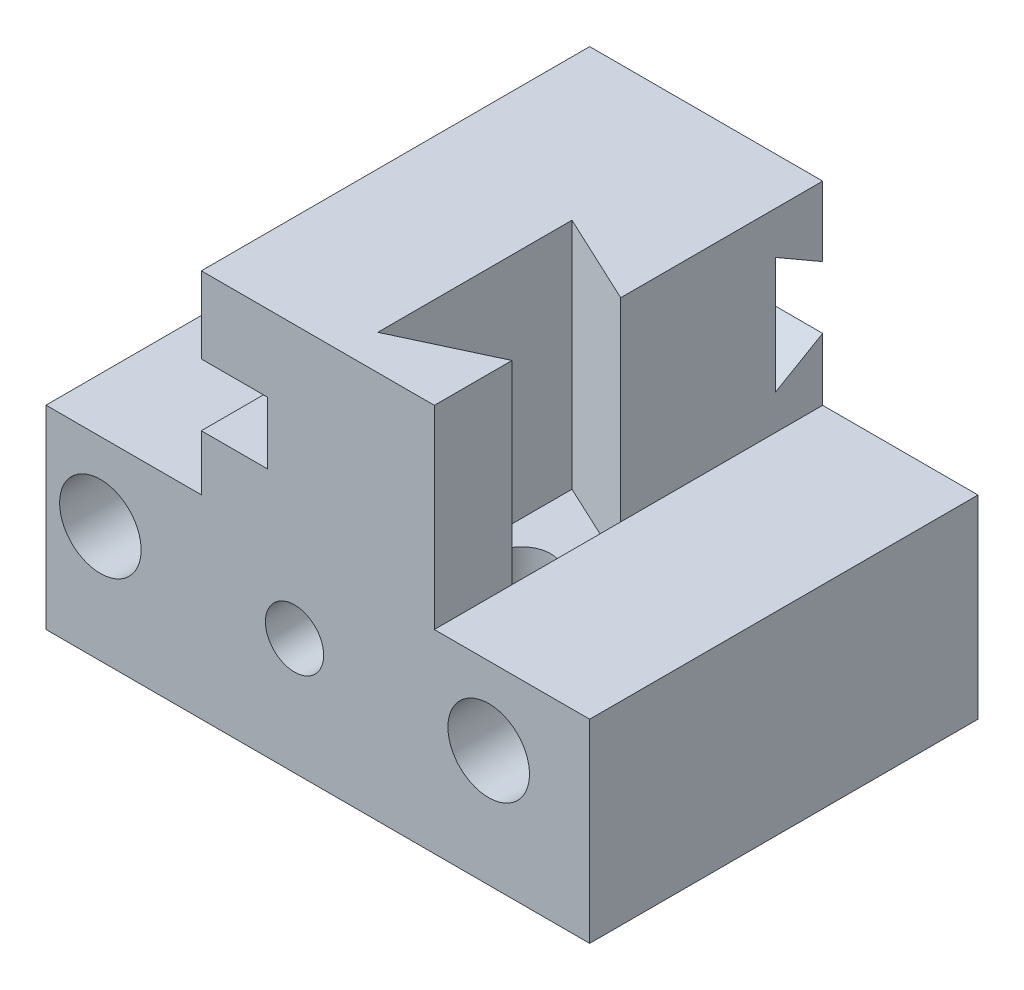
ISO-10303-21;
HEADER;
FILE_DESCRIPTION(('STEP AP214'),'2;1');
FILE_NAME('part.step','',(''),(''),'','','');
FILE_SCHEMA(('AUTOMOTIVE_DESIGN { 1 0 10303 214 1 1 1 1 }'));
ENDSEC;
DATA;
#1=APPLICATION_CONTEXT('core data for automotive mechanical design processes');
#2=APPLICATION_PROTOCOL_DEFINITION('international standard','automotive_design',2000,#1);
#3=PRODUCT_CONTEXT('',#1,'mechanical');
#4=PRODUCT('Part','Part','',(#3));
#5=PRODUCT_RELATED_PRODUCT_CATEGORY('part','',(#4));
#6=PRODUCT_DEFINITION_FORMATION('','',#4);
#7=PRODUCT_DEFINITION_CONTEXT('part definition',#1,'design');
#8=PRODUCT_DEFINITION('design','',#6,#7);
#9=PRODUCT_DEFINITION_SHAPE('','',#8);
#10=(LENGTH_UNIT() NAMED_UNIT(*) SI_UNIT(.MILLI.,.METRE.));
#11=(NAMED_UNIT(*) PLANE_ANGLE_UNIT() SI_UNIT($,.RADIAN.));
#12=(NAMED_UNIT(*) SI_UNIT($,.STERADIAN.) SOLID_ANGLE_UNIT());
#13=UNCERTAINTY_MEASURE_WITH_UNIT(LENGTH_MEASURE(1.E-05),#10,'distance_accuracy_value','');
#14=(GEOMETRIC_REPRESENTATION_CONTEXT(3) GLOBAL_UNCERTAINTY_ASSIGNED_CONTEXT((#13)) GLOBAL_UNIT_ASSIGNED_CONTEXT((#10,
#11,#12)) REPRESENTATION_CONTEXT('',''));
#15=CARTESIAN_POINT('',(0.,0.,0.));
#16=DIRECTION('',(0.,0.,1.));
#17=DIRECTION('',(1.,0.,0.));
#18=AXIS2_PLACEMENT_3D('',#15,#16,#17);
#19=CARTESIAN_POINT('',(2.,0.,0.));
#20=DIRECTION('',(1.,0.,0.));
#21=DIRECTION('',(0.,0.,-1.));
#22=AXIS2_PLACEMENT_3D('',#19,#20,#21);
#23=PLANE('',#22);
#24=DIRECTION('',(0.,1.,0.));
#25=VECTOR('',#24,1.);
#26=CARTESIAN_POINT('',(2.,4.0020682066455,5.));
#27=LINE('',#26,#25);
#28=CARTESIAN_POINT('',(2.,1.5020682066455,5.));
#29=VERTEX_POINT('',#28);
#30=CARTESIAN_POINT('',(2.,2.21668243931816,5.));
#31=VERTEX_POINT('',#30);
#32=EDGE_CURVE('E269',#29,#31,#27,.T.);
#33=ORIENTED_EDGE('',*,*,#32,.T.);
#34=DIRECTION('',(0.,0.,-1.));
#35=VECTOR('',#34,1.);
#36=CARTESIAN_POINT('',(2.,2.21668243931816,5.10621778264911));
#37=LINE('',#36,#35);
#38=CARTESIAN_POINT('',(2.,2.21668243931816,0.606217782649107));
#39=VERTEX_POINT('',#38);
#40=EDGE_CURVE('E201',#31,#39,#37,.T.);
#41=ORIENTED_EDGE('',*,*,#40,.T.);
#42=DIRECTION('',(0.,1.,0.));
#43=VECTOR('',#42,1.);
#44=CARTESIAN_POINT('',(2.,1.9520682066455,0.606217782649107));
#45=LINE('',#44,#43);
#46=CARTESIAN_POINT('',(2.,1.9520682066455,0.606217782649107));
#47=VERTEX_POINT('',#46);
#48=EDGE_CURVE('E220',#47,#39,#45,.T.);
#49=ORIENTED_EDGE('',*,*,#48,.F.);
#50=DIRECTION('',(0.,-0.5,0.866025403784439));
#51=VECTOR('',#50,1.);
#52=CARTESIAN_POINT('',(2.,2.3020682066455,0.));
#53=LINE('',#52,#51);
#54=CARTESIAN_POINT('',(2.,2.3020682066455,0.));
#55=VERTEX_POINT('',#54);
#56=EDGE_CURVE('E215',#55,#47,#53,.T.);
#57=ORIENTED_EDGE('',*,*,#56,.F.);
#58=DIRECTION('',(0.,-1.,0.));
#59=VECTOR('',#58,1.);
#60=CARTESIAN_POINT('',(2.,4.0020682066455,0.));
#61=LINE('',#60,#59);
#62=CARTESIAN_POINT('',(2.,1.5020682066455,0.));
#63=VERTEX_POINT('',#62);
#64=EDGE_CURVE('E272',#55,#63,#61,.T.);
#65=ORIENTED_EDGE('',*,*,#64,.T.);
#66=DIRECTION('',(0.,0.,1.));
#67=VECTOR('',#66,1.);
#68=CARTESIAN_POINT('',(2.,1.5020682066455,5.));
#69=LINE('',#68,#67);
#70=EDGE_CURVE('E277',#63,#29,#69,.T.);
#71=ORIENTED_EDGE('',*,*,#70,.T.);
#72=EDGE_LOOP('',(#33,#41,#49,#57,#65,#71));
#73=FACE_BOUND('',#72,.T.);
#74=ADVANCED_FACE('F35',(#73),#23,.F.);
#75=CARTESIAN_POINT('',(7.,-1.,0.));
#76=DIRECTION('',(0.,0.,-1.));
#77=DIRECTION('',(-1.,0.,0.));
#78=AXIS2_PLACEMENT_3D('',#75,#76,#77);
#79=PLANE('',#78);
#80=DIRECTION('',(-1.,0.,0.));
#81=VECTOR('',#80,1.);
#82=CARTESIAN_POINT('',(7.,3.1020682066455,0.));
#83=LINE('',#82,#81);
#84=CARTESIAN_POINT('',(5.,3.1020682066455,0.));
#85=VERTEX_POINT('',#84);
#86=CARTESIAN_POINT('',(2.,3.1020682066455,0.));
#87=VERTEX_POINT('',#86);
#88=EDGE_CURVE('E224',#85,#87,#83,.T.);
#89=ORIENTED_EDGE('',*,*,#88,.T.);
#90=CARTESIAN_POINT('',(2.,4.,0.));
#91=VERTEX_POINT('',#90);
#92=EDGE_CURVE('E274',#91,#87,#61,.T.);
#93=ORIENTED_EDGE('',*,*,#92,.F.);
#94=DIRECTION('',(-1.,0.,0.));
#95=VECTOR('',#94,1.);
#96=CARTESIAN_POINT('',(7.,4.,0.));
#97=LINE('',#96,#95);
#98=CARTESIAN_POINT('',(5.,4.,0.));
#99=VERTEX_POINT('',#98);
#100=EDGE_CURVE('E341',#99,#91,#97,.T.);
#101=ORIENTED_EDGE('',*,*,#100,.F.);
#102=DIRECTION('',(0.,1.,0.));
#103=VECTOR('',#102,1.);
#104=CARTESIAN_POINT('',(5.,4.,0.));
#105=LINE('',#104,#103);
#106=EDGE_CURVE('E302',#85,#99,#105,.T.);
#107=ORIENTED_EDGE('',*,*,#106,.F.);
#108=EDGE_LOOP('',(#89,#93,#101,#107));
#109=FACE_BOUND('',#108,.T.);
#110=ADVANCED_FACE('F389',(#109),#79,.T.);
#111=CARTESIAN_POINT('',(5.,0.,0.));
#112=DIRECTION('',(1.,0.,0.));
#113=DIRECTION('',(0.,0.,-1.));
#114=AXIS2_PLACEMENT_3D('',#111,#112,#113);
#115=PLANE('',#114);
#116=DIRECTION('',(0.,-1.,0.));
#117=VECTOR('',#116,1.);
#118=CARTESIAN_POINT('',(5.,0.,4.));
#119=LINE('',#118,#117);
#120=CARTESIAN_POINT('',(5.,4.,4.));
#121=VERTEX_POINT('',#120);
#122=CARTESIAN_POINT('',(5.,1.5,4.));
#123=VERTEX_POINT('',#122);
#124=EDGE_CURVE('E11',#121,#123,#119,.T.);
#125=ORIENTED_EDGE('',*,*,#124,.F.);
#126=DIRECTION('',(0.,0.,1.));
#127=VECTOR('',#126,1.);
#128=CARTESIAN_POINT('',(5.,4.,5.));
#129=LINE('',#128,#127);
#130=CARTESIAN_POINT('',(5.,4.,5.));
#131=VERTEX_POINT('',#130);
#132=EDGE_CURVE('E307',#121,#131,#129,.T.);
#133=ORIENTED_EDGE('',*,*,#132,.T.);
#134=DIRECTION('',(0.,-1.,0.));
#135=VECTOR('',#134,1.);
#136=CARTESIAN_POINT('',(5.,4.,5.));
#137=LINE('',#136,#135);
#138=CARTESIAN_POINT('',(5.,1.5,5.));
#139=VERTEX_POINT('',#138);
#140=EDGE_CURVE('E295',#131,#139,#137,.T.);
#141=ORIENTED_EDGE('',*,*,#140,.T.);
#142=DIRECTION('',(0.,0.,-1.));
#143=VECTOR('',#142,1.);
#144=CARTESIAN_POINT('',(5.,1.5,5.));
#145=LINE('',#144,#143);
#146=EDGE_CURVE('E299',#139,#123,#145,.T.);
#147=ORIENTED_EDGE('',*,*,#146,.T.);
#148=EDGE_LOOP('',(#125,#133,#141,#147));
#149=FACE_BOUND('',#148,.T.);
#150=ADVANCED_FACE('F404',(#149),#115,.T.);
#151=CARTESIAN_POINT('',(0.,4.,0.));
#152=DIRECTION('',(0.,1.,0.));
#153=DIRECTION('',(0.,0.,1.));
#154=AXIS2_PLACEMENT_3D('',#151,#152,#153);
#155=PLANE('',#154);
#156=DIRECTION('',(0.906093768414596,0.,-0.423076923076923));
#157=VECTOR('',#156,1.);
#158=CARTESIAN_POINT('',(3.82207810106103,4.,4.55));
#159=LINE('',#158,#157);
#160=CARTESIAN_POINT('',(3.82207810106103,4.,4.55));
#161=VERTEX_POINT('',#160);
#162=EDGE_CURVE('E244',#161,#121,#159,.T.);
#163=ORIENTED_EDGE('',*,*,#162,.F.);
#164=DIRECTION('',(0.,0.,1.));
#165=VECTOR('',#164,1.);
#166=CARTESIAN_POINT('',(3.82207810106103,4.,2.05));
#167=LINE('',#166,#165);
#168=CARTESIAN_POINT('',(3.82207810106103,4.,2.05));
#169=VERTEX_POINT('',#168);
#170=EDGE_CURVE('E256',#169,#161,#167,.T.);
#171=ORIENTED_EDGE('',*,*,#170,.F.);
#172=DIRECTION('',(-0.906093768414596,0.,-0.423076923076923));
#173=VECTOR('',#172,1.);
#174=CARTESIAN_POINT('',(5.,4.,2.6));
#175=LINE('',#174,#173);
#176=CARTESIAN_POINT('',(5.,4.,2.6));
#177=VERTEX_POINT('',#176);
#178=EDGE_CURVE('E239',#177,#169,#175,.T.);
#179=ORIENTED_EDGE('',*,*,#178,.F.);
#180=EDGE_CURVE('E308',#99,#177,#129,.T.);
#181=ORIENTED_EDGE('',*,*,#180,.F.);
#182=ORIENTED_EDGE('',*,*,#100,.T.);
#183=DIRECTION('',(0.,0.,-1.));
#184=VECTOR('',#183,1.);
#185=CARTESIAN_POINT('',(2.,4.,0.));
#186=LINE('',#185,#184);
#187=CARTESIAN_POINT('',(2.,4.,5.));
#188=VERTEX_POINT('',#187);
#189=EDGE_CURVE('E285',#188,#91,#186,.T.);
#190=ORIENTED_EDGE('',*,*,#189,.F.);
#191=DIRECTION('',(1.,0.,0.));
#192=VECTOR('',#191,1.);
#193=CARTESIAN_POINT('',(0.,4.,5.));
#194=LINE('',#193,#192);
#195=EDGE_CURVE('E346',#188,#131,#194,.T.);
#196=ORIENTED_EDGE('',*,*,#195,.T.);
#197=ORIENTED_EDGE('',*,*,#132,.F.);
#198=EDGE_LOOP('',(#163,#171,#179,#181,#182,#190,#196,#197));
#199=FACE_BOUND('',#198,.T.);
#200=ADVANCED_FACE('F382',(#199),#155,.T.);
#201=DIRECTION('',(-1.,0.,0.));
#202=VECTOR('',#201,1.);
#203=CARTESIAN_POINT('',(7.,2.3020682066455,0.));
#204=LINE('',#203,#202);
#205=CARTESIAN_POINT('',(5.,2.3020682066455,0.));
#206=VERTEX_POINT('',#205);
#207=EDGE_CURVE('E58',#206,#55,#204,.T.);
#208=ORIENTED_EDGE('',*,*,#207,.F.);
#209=CARTESIAN_POINT('',(5.,1.5,0.));
#210=VERTEX_POINT('',#209);
#211=EDGE_CURVE('E304',#210,#206,#105,.T.);
#212=ORIENTED_EDGE('',*,*,#211,.F.);
#213=DIRECTION('',(1.,0.,0.));
#214=VECTOR('',#213,1.);
#215=CARTESIAN_POINT('',(5.,1.5,0.));
#216=LINE('',#215,#214);
#217=CARTESIAN_POINT('',(7.,1.5,0.));
#218=VERTEX_POINT('',#217);
#219=EDGE_CURVE('E313',#210,#218,#216,.T.);
#220=ORIENTED_EDGE('',*,*,#219,.T.);
#221=DIRECTION('',(0.,1.,0.));
#222=VECTOR('',#221,1.);
#223=CARTESIAN_POINT('',(7.,-1.,0.));
#224=LINE('',#223,#222);
#225=CARTESIAN_POINT('',(7.,-1.,0.));
#226=VERTEX_POINT('',#225);
#227=EDGE_CURVE('E360',#226,#218,#224,.T.);
#228=ORIENTED_EDGE('',*,*,#227,.F.);
#229=DIRECTION('',(-1.,0.,0.));
#230=VECTOR('',#229,1.);
#231=CARTESIAN_POINT('',(7.,-1.,0.));
#232=LINE('',#231,#230);
#233=CARTESIAN_POINT('',(0.,-1.,0.));
#234=VERTEX_POINT('',#233);
#235=EDGE_CURVE('E342',#226,#234,#232,.T.);
#236=ORIENTED_EDGE('',*,*,#235,.T.);
#237=DIRECTION('',(0.,1.,0.));
#238=VECTOR('',#237,1.);
#239=CARTESIAN_POINT('',(0.,-1.,0.));
#240=LINE('',#239,#238);
#241=CARTESIAN_POINT('',(0.,1.5020682066455,0.));
#242=VERTEX_POINT('',#241);
#243=EDGE_CURVE('E355',#234,#242,#240,.T.);
#244=ORIENTED_EDGE('',*,*,#243,.T.);
#245=DIRECTION('',(-1.,0.,0.));
#246=VECTOR('',#245,1.);
#247=CARTESIAN_POINT('',(2.,1.5020682066455,0.));
#248=LINE('',#247,#246);
#249=EDGE_CURVE('E280',#63,#242,#248,.T.);
#250=ORIENTED_EDGE('',*,*,#249,.F.);
#251=ORIENTED_EDGE('',*,*,#64,.F.);
#252=EDGE_LOOP('',(#208,#212,#220,#228,#236,#244,#250,#251));
#253=FACE_BOUND('',#252,.T.);
#254=CARTESIAN_POINT('',(3.2,0.5,0.));
#255=DIRECTION('',(0.,0.,-1.));
#256=DIRECTION('',(-1.,0.,0.));
#257=AXIS2_PLACEMENT_3D('',#254,#255,#256);
#258=CIRCLE('',#257,0.374999999999999);
#259=CARTESIAN_POINT('',(2.825,0.5,0.));
#260=VERTEX_POINT('',#259);
#261=EDGE_CURVE('E288',#260,#260,#258,.T.);
#262=ORIENTED_EDGE('',*,*,#261,.F.);
#263=EDGE_LOOP('',(#262));
#264=FACE_BOUND('',#263,.T.);
#265=CARTESIAN_POINT('',(5.7,0.499999999999999,0.));
#266=DIRECTION('',(0.,0.,-1.));
#267=DIRECTION('',(-1.,0.,0.));
#268=AXIS2_PLACEMENT_3D('',#265,#266,#267);
#269=CIRCLE('',#268,0.650000000000015);
#270=CARTESIAN_POINT('',(5.04999999999998,0.499999999999999,0.));
#271=VERTEX_POINT('',#270);
#272=EDGE_CURVE('E316',#271,#271,#269,.T.);
#273=ORIENTED_EDGE('',*,*,#272,.F.);
#274=EDGE_LOOP('',(#273));
#275=FACE_BOUND('',#274,.T.);
#276=CARTESIAN_POINT('',(0.7,0.5,0.));
#277=DIRECTION('',(0.,0.,-1.));
#278=DIRECTION('',(-1.,0.,0.));
#279=AXIS2_PLACEMENT_3D('',#276,#277,#278);
#280=CIRCLE('',#279,0.650000000000015);
#281=CARTESIAN_POINT('',(0.0499999999999852,0.5,0.));
#282=VERTEX_POINT('',#281);
#283=EDGE_CURVE('E329',#282,#282,#280,.T.);
#284=ORIENTED_EDGE('',*,*,#283,.F.);
#285=EDGE_LOOP('',(#284));
#286=FACE_BOUND('',#285,.T.);
#287=ADVANCED_FACE('F37',(#253,#264,#275,#286),#79,.T.);
#288=CARTESIAN_POINT('',(7.,-1.,5.));
#289=DIRECTION('',(1.,0.,0.));
#290=DIRECTION('',(0.,0.,-1.));
#291=AXIS2_PLACEMENT_3D('',#288,#289,#290);
#292=PLANE('',#291);
#293=DIRECTION('',(0.,0.,-1.));
#294=VECTOR('',#293,1.);
#295=CARTESIAN_POINT('',(7.,1.5,5.));
#296=LINE('',#295,#294);
#297=CARTESIAN_POINT('',(7.,1.5,5.));
#298=VERTEX_POINT('',#297);
#299=EDGE_CURVE('E294',#298,#218,#296,.T.);
#300=ORIENTED_EDGE('',*,*,#299,.F.);
#301=DIRECTION('',(0.,1.,0.));
#302=VECTOR('',#301,1.);
#303=CARTESIAN_POINT('',(7.,-1.,5.));
#304=LINE('',#303,#302);
#305=CARTESIAN_POINT('',(7.,-1.,5.));
#306=VERTEX_POINT('',#305);
#307=EDGE_CURVE('E363',#306,#298,#304,.T.);
#308=ORIENTED_EDGE('',*,*,#307,.F.);
#309=DIRECTION('',(0.,0.,-1.));
#310=VECTOR('',#309,1.);
#311=CARTESIAN_POINT('',(7.,-1.,5.));
#312=LINE('',#311,#310);
#313=EDGE_CURVE('E352',#306,#226,#312,.T.);
#314=ORIENTED_EDGE('',*,*,#313,.T.);
#315=ORIENTED_EDGE('',*,*,#227,.T.);
#316=EDGE_LOOP('',(#300,#308,#314,#315));
#317=FACE_BOUND('',#316,.T.);
#318=ADVANCED_FACE('F443',(#317),#292,.T.);
#319=CARTESIAN_POINT('',(0.,-1.,5.));
#320=DIRECTION('',(0.,0.,1.));
#321=DIRECTION('',(1.,0.,0.));
#322=AXIS2_PLACEMENT_3D('',#319,#320,#321);
#323=PLANE('',#322);
#324=DIRECTION('',(1.,0.,0.));
#325=VECTOR('',#324,1.);
#326=CARTESIAN_POINT('',(0.,2.21668243931816,5.));
#327=LINE('',#326,#325);
#328=CARTESIAN_POINT('',(2.85234978849758,2.21668243931816,5.));
#329=VERTEX_POINT('',#328);
#330=EDGE_CURVE('E209',#31,#329,#327,.T.);
#331=ORIENTED_EDGE('',*,*,#330,.F.);
#332=ORIENTED_EDGE('',*,*,#32,.F.);
#333=DIRECTION('',(-1.,0.,0.));
#334=VECTOR('',#333,1.);
#335=CARTESIAN_POINT('',(2.,1.5020682066455,5.));
#336=LINE('',#335,#334);
#337=CARTESIAN_POINT('',(0.,1.5020682066455,5.));
#338=VERTEX_POINT('',#337);
#339=EDGE_CURVE('E282',#29,#338,#336,.T.);
#340=ORIENTED_EDGE('',*,*,#339,.T.);
#341=DIRECTION('',(0.,1.,0.));
#342=VECTOR('',#341,1.);
#343=CARTESIAN_POINT('',(0.,-1.,5.));
#344=LINE('',#343,#342);
#345=CARTESIAN_POINT('',(0.,-1.,5.));
#346=VERTEX_POINT('',#345);
#347=EDGE_CURVE('E366',#346,#338,#344,.T.);
#348=ORIENTED_EDGE('',*,*,#347,.F.);
#349=DIRECTION('',(1.,0.,0.));
#350=VECTOR('',#349,1.);
#351=CARTESIAN_POINT('',(0.,-1.,5.));
#352=LINE('',#351,#350);
#353=EDGE_CURVE('E349',#346,#306,#352,.T.);
#354=ORIENTED_EDGE('',*,*,#353,.T.);
#355=ORIENTED_EDGE('',*,*,#307,.T.);
#356=DIRECTION('',(1.,0.,0.));
#357=VECTOR('',#356,1.);
#358=CARTESIAN_POINT('',(5.,1.5,5.));
#359=LINE('',#358,#357);
#360=EDGE_CURVE('E311',#139,#298,#359,.T.);
#361=ORIENTED_EDGE('',*,*,#360,.F.);
#362=ORIENTED_EDGE('',*,*,#140,.F.);
#363=ORIENTED_EDGE('',*,*,#195,.F.);
#364=CARTESIAN_POINT('',(2.,3.01668243931816,5.));
#365=VERTEX_POINT('',#364);
#366=EDGE_CURVE('E273',#365,#188,#27,.T.);
#367=ORIENTED_EDGE('',*,*,#366,.F.);
#368=DIRECTION('',(-1.,0.,0.));
#369=VECTOR('',#368,1.);
#370=CARTESIAN_POINT('',(0.,3.01668243931816,5.));
#371=LINE('',#370,#369);
#372=CARTESIAN_POINT('',(2.85234978849758,3.01668243931816,5.));
#373=VERTEX_POINT('',#372);
#374=EDGE_CURVE('E204',#373,#365,#371,.T.);
#375=ORIENTED_EDGE('',*,*,#374,.F.);
#376=DIRECTION('',(0.,1.,0.));
#377=VECTOR('',#376,1.);
#378=CARTESIAN_POINT('',(2.85234978849758,-1.,5.));
#379=LINE('',#378,#377);
#380=EDGE_CURVE('E186',#329,#373,#379,.T.);
#381=ORIENTED_EDGE('',*,*,#380,.F.);
#382=EDGE_LOOP('',(#331,#332,#340,#348,#354,#355,#361,#362,#363,#367,#375,#381));
#383=FACE_BOUND('',#382,.T.);
#384=CARTESIAN_POINT('',(3.2,0.5,5.));
#385=DIRECTION('',(0.,0.,1.));
#386=DIRECTION('',(1.,0.,0.));
#387=AXIS2_PLACEMENT_3D('',#384,#385,#386);
#388=CIRCLE('',#387,0.374999999999999);
#389=CARTESIAN_POINT('',(3.575,0.5,5.));
#390=VERTEX_POINT('',#389);
#391=EDGE_CURVE('E291',#390,#390,#388,.T.);
#392=ORIENTED_EDGE('',*,*,#391,.F.);
#393=EDGE_LOOP('',(#392));
#394=FACE_BOUND('',#393,.T.);
#395=CARTESIAN_POINT('',(5.7,0.499999999999999,5.));
#396=DIRECTION('',(0.,0.,-1.));
#397=DIRECTION('',(-1.,0.,0.));
#398=AXIS2_PLACEMENT_3D('',#395,#396,#397);
#399=CIRCLE('',#398,0.525000000000013);
#400=CARTESIAN_POINT('',(5.17499999999999,0.499999999999999,5.));
#401=VERTEX_POINT('',#400);
#402=EDGE_CURVE('E326',#401,#401,#399,.T.);
#403=ORIENTED_EDGE('',*,*,#402,.T.);
#404=EDGE_LOOP('',(#403));
#405=FACE_BOUND('',#404,.T.);
#406=CARTESIAN_POINT('',(0.7,0.5,5.));
#407=DIRECTION('',(0.,0.,-1.));
#408=DIRECTION('',(-1.,0.,0.));
#409=AXIS2_PLACEMENT_3D('',#406,#407,#408);
#410=CIRCLE('',#409,0.525000000000013);
#411=CARTESIAN_POINT('',(0.174999999999987,0.5,5.));
#412=VERTEX_POINT('',#411);
#413=EDGE_CURVE('E338',#412,#412,#410,.T.);
#414=ORIENTED_EDGE('',*,*,#413,.T.);
#415=EDGE_LOOP('',(#414));
#416=FACE_BOUND('',#415,.T.);
#417=ADVANCED_FACE('F399',(#383,#394,#405,#416),#323,.T.);
#418=CARTESIAN_POINT('',(0.,-1.,0.));
#419=DIRECTION('',(-1.,0.,0.));
#420=DIRECTION('',(0.,0.,1.));
#421=AXIS2_PLACEMENT_3D('',#418,#419,#420);
#422=PLANE('',#421);
#423=DIRECTION('',(0.,0.,1.));
#424=VECTOR('',#423,1.);
#425=CARTESIAN_POINT('',(0.,1.5020682066455,5.));
#426=LINE('',#425,#424);
#427=EDGE_CURVE('E263',#242,#338,#426,.T.);
#428=ORIENTED_EDGE('',*,*,#427,.F.);
#429=ORIENTED_EDGE('',*,*,#243,.F.);
#430=DIRECTION('',(0.,0.,1.));
#431=VECTOR('',#430,1.);
#432=CARTESIAN_POINT('',(0.,-1.,0.));
#433=LINE('',#432,#431);
#434=EDGE_CURVE('E345',#234,#346,#433,.T.);
#435=ORIENTED_EDGE('',*,*,#434,.T.);
#436=ORIENTED_EDGE('',*,*,#347,.T.);
#437=EDGE_LOOP('',(#428,#429,#435,#436));
#438=FACE_BOUND('',#437,.T.);
#439=ADVANCED_FACE('F436',(#438),#422,.T.);
#440=CARTESIAN_POINT('',(0.,-1.,0.));
#441=DIRECTION('',(0.,1.,0.));
#442=DIRECTION('',(0.,0.,1.));
#443=AXIS2_PLACEMENT_3D('',#440,#441,#442);
#444=PLANE('',#443);
#445=ORIENTED_EDGE('',*,*,#235,.F.);
#446=ORIENTED_EDGE('',*,*,#313,.F.);
#447=ORIENTED_EDGE('',*,*,#353,.F.);
#448=ORIENTED_EDGE('',*,*,#434,.F.);
#449=EDGE_LOOP('',(#445,#446,#447,#448));
#450=FACE_BOUND('',#449,.T.);
#451=ADVANCED_FACE('F440',(#450),#444,.F.);
#452=CARTESIAN_POINT('',(0.7,0.5,0.));
#453=DIRECTION('',(0.,0.,-1.));
#454=DIRECTION('',(-1.,0.,0.));
#455=AXIS2_PLACEMENT_3D('',#452,#453,#454);
#456=CYLINDRICAL_SURFACE('',#455,0.525000000000013);
#457=ORIENTED_EDGE('',*,*,#413,.F.);
#458=EDGE_LOOP('',(#457));
#459=FACE_BOUND('',#458,.T.);
#460=CARTESIAN_POINT('',(0.7,0.5,1.2));
#461=DIRECTION('',(0.,0.,-1.));
#462=DIRECTION('',(-1.,0.,0.));
#463=AXIS2_PLACEMENT_3D('',#460,#461,#462);
#464=CIRCLE('',#463,0.525000000000013);
#465=CARTESIAN_POINT('',(0.174999999999987,0.5,1.2));
#466=VERTEX_POINT('',#465);
#467=EDGE_CURVE('E335',#466,#466,#464,.T.);
#468=ORIENTED_EDGE('',*,*,#467,.T.);
#469=EDGE_LOOP('',(#468));
#470=FACE_BOUND('',#469,.T.);
#471=ADVANCED_FACE('F678',(#459,#470),#456,.F.);
#472=CARTESIAN_POINT('',(1.22500000000001,0.5,1.2));
#473=DIRECTION('',(0.,0.,1.));
#474=DIRECTION('',(1.,0.,0.));
#475=AXIS2_PLACEMENT_3D('',#472,#473,#474);
#476=PLANE('',#475);
#477=ORIENTED_EDGE('',*,*,#467,.F.);
#478=EDGE_LOOP('',(#477));
#479=FACE_BOUND('',#478,.T.);
#480=CARTESIAN_POINT('',(0.7,0.5,1.2));
#481=DIRECTION('',(0.,0.,-1.));
#482=DIRECTION('',(-1.,0.,0.));
#483=AXIS2_PLACEMENT_3D('',#480,#481,#482);
#484=CIRCLE('',#483,0.650000000000015);
#485=CARTESIAN_POINT('',(0.0499999999999852,0.5,1.2));
#486=VERTEX_POINT('',#485);
#487=EDGE_CURVE('E332',#486,#486,#484,.T.);
#488=ORIENTED_EDGE('',*,*,#487,.T.);
#489=EDGE_LOOP('',(#488));
#490=FACE_BOUND('',#489,.T.);
#491=ADVANCED_FACE('F674',(#479,#490),#476,.F.);
#492=CARTESIAN_POINT('',(0.7,0.5,0.));
#493=DIRECTION('',(0.,0.,-1.));
#494=DIRECTION('',(-1.,0.,0.));
#495=AXIS2_PLACEMENT_3D('',#492,#493,#494);
#496=CYLINDRICAL_SURFACE('',#495,0.650000000000015);
#497=ORIENTED_EDGE('',*,*,#487,.F.);
#498=EDGE_LOOP('',(#497));
#499=FACE_BOUND('',#498,.T.);
#500=ORIENTED_EDGE('',*,*,#283,.T.);
#501=EDGE_LOOP('',(#500));
#502=FACE_BOUND('',#501,.T.);
#503=ADVANCED_FACE('F670',(#499,#502),#496,.F.);
#504=CARTESIAN_POINT('',(5.7,0.499999999999999,0.));
#505=DIRECTION('',(0.,0.,-1.));
#506=DIRECTION('',(-1.,0.,0.));
#507=AXIS2_PLACEMENT_3D('',#504,#505,#506);
#508=CYLINDRICAL_SURFACE('',#507,0.525000000000013);
#509=ORIENTED_EDGE('',*,*,#402,.F.);
#510=EDGE_LOOP('',(#509));
#511=FACE_BOUND('',#510,.T.);
#512=CARTESIAN_POINT('',(5.7,0.499999999999999,1.2));
#513=DIRECTION('',(0.,0.,-1.));
#514=DIRECTION('',(-1.,0.,0.));
#515=AXIS2_PLACEMENT_3D('',#512,#513,#514);
#516=CIRCLE('',#515,0.525000000000013);
#517=CARTESIAN_POINT('',(5.17499999999999,0.499999999999999,1.2));
#518=VERTEX_POINT('',#517);
#519=EDGE_CURVE('E323',#518,#518,#516,.T.);
#520=ORIENTED_EDGE('',*,*,#519,.T.);
#521=EDGE_LOOP('',(#520));
#522=FACE_BOUND('',#521,.T.);
#523=ADVANCED_FACE('F666',(#511,#522),#508,.F.);
#524=CARTESIAN_POINT('',(6.22500000000001,0.499999999999999,1.2));
#525=DIRECTION('',(0.,0.,1.));
#526=DIRECTION('',(1.,0.,0.));
#527=AXIS2_PLACEMENT_3D('',#524,#525,#526);
#528=PLANE('',#527);
#529=ORIENTED_EDGE('',*,*,#519,.F.);
#530=EDGE_LOOP('',(#529));
#531=FACE_BOUND('',#530,.T.);
#532=CARTESIAN_POINT('',(5.7,0.499999999999999,1.2));
#533=DIRECTION('',(0.,0.,-1.));
#534=DIRECTION('',(-1.,0.,0.));
#535=AXIS2_PLACEMENT_3D('',#532,#533,#534);
#536=CIRCLE('',#535,0.650000000000015);
#537=CARTESIAN_POINT('',(5.04999999999998,0.499999999999999,1.2));
#538=VERTEX_POINT('',#537);
#539=EDGE_CURVE('E320',#538,#538,#536,.T.);
#540=ORIENTED_EDGE('',*,*,#539,.T.);
#541=EDGE_LOOP('',(#540));
#542=FACE_BOUND('',#541,.T.);
#543=ADVANCED_FACE('F660',(#531,#542),#528,.F.);
#544=CARTESIAN_POINT('',(5.7,0.499999999999999,0.));
#545=DIRECTION('',(0.,0.,-1.));
#546=DIRECTION('',(-1.,0.,0.));
#547=AXIS2_PLACEMENT_3D('',#544,#545,#546);
#548=CYLINDRICAL_SURFACE('',#547,0.650000000000015);
#549=ORIENTED_EDGE('',*,*,#539,.F.);
#550=EDGE_LOOP('',(#549));
#551=FACE_BOUND('',#550,.T.);
#552=ORIENTED_EDGE('',*,*,#272,.T.);
#553=EDGE_LOOP('',(#552));
#554=FACE_BOUND('',#553,.T.);
#555=ADVANCED_FACE('F640',(#551,#554),#548,.F.);
#556=CARTESIAN_POINT('',(5.,1.5,5.));
#557=DIRECTION('',(0.,-1.,0.));
#558=DIRECTION('',(0.,0.,-1.));
#559=AXIS2_PLACEMENT_3D('',#556,#557,#558);
#560=PLANE('',#559);
#561=ORIENTED_EDGE('',*,*,#299,.T.);
#562=ORIENTED_EDGE('',*,*,#219,.F.);
#563=CARTESIAN_POINT('',(5.,1.5,2.6));
#564=VERTEX_POINT('',#563);
#565=EDGE_CURVE('E298',#564,#210,#145,.T.);
#566=ORIENTED_EDGE('',*,*,#565,.F.);
#567=EDGE_CURVE('E303',#123,#564,#145,.T.);
#568=ORIENTED_EDGE('',*,*,#567,.F.);
#569=ORIENTED_EDGE('',*,*,#146,.F.);
#570=ORIENTED_EDGE('',*,*,#360,.T.);
#571=EDGE_LOOP('',(#561,#562,#566,#568,#569,#570));
#572=FACE_BOUND('',#571,.T.);
#573=ADVANCED_FACE('F421',(#572),#560,.F.);
#574=DIRECTION('',(0.,0.5,0.866025403784439));
#575=VECTOR('',#574,1.);
#576=CARTESIAN_POINT('',(5.,2.32655115498413,-1.34323493561352));
#577=LINE('',#576,#575);
#578=CARTESIAN_POINT('',(5.,3.4520682066455,0.606217782649107));
#579=VERTEX_POINT('',#578);
#580=EDGE_CURVE('E237',#85,#579,#577,.T.);
#581=ORIENTED_EDGE('',*,*,#580,.F.);
#582=ORIENTED_EDGE('',*,*,#106,.T.);
#583=ORIENTED_EDGE('',*,*,#180,.T.);
#584=DIRECTION('',(0.,1.,0.));
#585=VECTOR('',#584,1.);
#586=CARTESIAN_POINT('',(5.,0.,2.6));
#587=LINE('',#586,#585);
#588=EDGE_CURVE('E43',#564,#177,#587,.T.);
#589=ORIENTED_EDGE('',*,*,#588,.F.);
#590=ORIENTED_EDGE('',*,*,#565,.T.);
#591=ORIENTED_EDGE('',*,*,#211,.T.);
#592=DIRECTION('',(0.,0.5,-0.866025403784439));
#593=VECTOR('',#592,1.);
#594=CARTESIAN_POINT('',(5.,1.72655115498413,0.996824774099746));
#595=LINE('',#594,#593);
#596=CARTESIAN_POINT('',(5.,1.9520682066455,0.606217782649107));
#597=VERTEX_POINT('',#596);
#598=EDGE_CURVE('E227',#597,#206,#595,.T.);
#599=ORIENTED_EDGE('',*,*,#598,.F.);
#600=DIRECTION('',(0.,-1.,0.));
#601=VECTOR('',#600,1.);
#602=CARTESIAN_POINT('',(5.,0.,0.606217782649107));
#603=LINE('',#602,#601);
#604=EDGE_CURVE('E235',#579,#597,#603,.T.);
#605=ORIENTED_EDGE('',*,*,#604,.F.);
#606=EDGE_LOOP('',(#581,#582,#583,#589,#590,#591,#599,#605));
#607=FACE_BOUND('',#606,.T.);
#608=ADVANCED_FACE('F385',(#607),#115,.T.);
#609=CARTESIAN_POINT('',(3.2,0.5,0.));
#610=DIRECTION('',(0.,0.,-1.));
#611=DIRECTION('',(-1.,0.,0.));
#612=AXIS2_PLACEMENT_3D('',#609,#610,#611);
#613=CYLINDRICAL_SURFACE('',#612,0.374999999999999);
#614=ORIENTED_EDGE('',*,*,#261,.T.);
#615=EDGE_LOOP('',(#614));
#616=FACE_BOUND('',#615,.T.);
#617=ORIENTED_EDGE('',*,*,#391,.T.);
#618=EDGE_LOOP('',(#617));
#619=FACE_BOUND('',#618,.T.);
#620=ADVANCED_FACE('F465',(#616,#619),#613,.F.);
#621=CARTESIAN_POINT('',(2.,1.5020682066455,5.));
#622=DIRECTION('',(0.,-1.,0.));
#623=DIRECTION('',(0.,0.,-1.));
#624=AXIS2_PLACEMENT_3D('',#621,#622,#623);
#625=PLANE('',#624);
#626=ORIENTED_EDGE('',*,*,#427,.T.);
#627=ORIENTED_EDGE('',*,*,#339,.F.);
#628=ORIENTED_EDGE('',*,*,#70,.F.);
#629=ORIENTED_EDGE('',*,*,#249,.T.);
#630=EDGE_LOOP('',(#626,#627,#628,#629));
#631=FACE_BOUND('',#630,.T.);
#632=ADVANCED_FACE('F432',(#631),#625,.F.);
#633=CARTESIAN_POINT('',(2.,3.01668243931816,0.606217782649107));
#634=VERTEX_POINT('',#633);
#635=CARTESIAN_POINT('',(2.,3.4520682066455,0.606217782649107));
#636=VERTEX_POINT('',#635);
#637=EDGE_CURVE('E219',#634,#636,#45,.T.);
#638=ORIENTED_EDGE('',*,*,#637,.F.);
#639=DIRECTION('',(0.,0.,-1.));
#640=VECTOR('',#639,1.);
#641=CARTESIAN_POINT('',(2.,3.01668243931816,5.10621778264911));
#642=LINE('',#641,#640);
#643=EDGE_CURVE('E50',#365,#634,#642,.T.);
#644=ORIENTED_EDGE('',*,*,#643,.F.);
#645=ORIENTED_EDGE('',*,*,#366,.T.);
#646=ORIENTED_EDGE('',*,*,#189,.T.);
#647=ORIENTED_EDGE('',*,*,#92,.T.);
#648=DIRECTION('',(0.,-0.5,-0.866025403784439));
#649=VECTOR('',#648,1.);
#650=CARTESIAN_POINT('',(2.,3.4520682066455,0.606217782649107));
#651=LINE('',#650,#649);
#652=EDGE_CURVE('E222',#636,#87,#651,.T.);
#653=ORIENTED_EDGE('',*,*,#652,.F.);
#654=EDGE_LOOP('',(#638,#644,#645,#646,#647,#653));
#655=FACE_BOUND('',#654,.T.);
#656=ADVANCED_FACE('F454',(#655),#23,.F.);
#657=CARTESIAN_POINT('',(5.,1.,4.));
#658=DIRECTION('',(1.,0.,0.));
#659=DIRECTION('',(0.,0.,-1.));
#660=AXIS2_PLACEMENT_3D('',#657,#658,#659);
#661=PLANE('',#660);
#662=DIRECTION('',(0.,1.,0.));
#663=VECTOR('',#662,1.);
#664=CARTESIAN_POINT('',(5.,1.,2.6));
#665=LINE('',#664,#663);
#666=CARTESIAN_POINT('',(5.,1.,2.6));
#667=VERTEX_POINT('',#666);
#668=EDGE_CURVE('E253',#667,#564,#665,.T.);
#669=ORIENTED_EDGE('',*,*,#668,.F.);
#670=DIRECTION('',(0.,0.,-1.));
#671=VECTOR('',#670,1.);
#672=CARTESIAN_POINT('',(5.,1.,4.));
#673=LINE('',#672,#671);
#674=CARTESIAN_POINT('',(5.,1.,4.));
#675=VERTEX_POINT('',#674);
#676=EDGE_CURVE('E240',#675,#667,#673,.T.);
#677=ORIENTED_EDGE('',*,*,#676,.F.);
#678=DIRECTION('',(0.,1.,0.));
#679=VECTOR('',#678,1.);
#680=CARTESIAN_POINT('',(5.,1.,4.));
#681=LINE('',#680,#679);
#682=EDGE_CURVE('E260',#675,#123,#681,.T.);
#683=ORIENTED_EDGE('',*,*,#682,.T.);
#684=ORIENTED_EDGE('',*,*,#567,.T.);
#685=EDGE_LOOP('',(#669,#677,#683,#684));
#686=FACE_BOUND('',#685,.T.);
#687=ADVANCED_FACE('F415',(#686),#661,.F.);
#688=CARTESIAN_POINT('',(3.82207810106103,1.,4.55));
#689=DIRECTION('',(0.423076923076923,0.,0.906093768414596));
#690=DIRECTION('',(0.906093768414596,0.,-0.423076923076923));
#691=AXIS2_PLACEMENT_3D('',#688,#689,#690);
#692=PLANE('',#691);
#693=ORIENTED_EDGE('',*,*,#162,.T.);
#694=ORIENTED_EDGE('',*,*,#124,.T.);
#695=ORIENTED_EDGE('',*,*,#682,.F.);
#696=DIRECTION('',(0.906093768414596,0.,-0.423076923076923));
#697=VECTOR('',#696,1.);
#698=CARTESIAN_POINT('',(3.82207810106103,1.,4.55));
#699=LINE('',#698,#697);
#700=CARTESIAN_POINT('',(3.82207810106103,1.,4.55));
#701=VERTEX_POINT('',#700);
#702=EDGE_CURVE('E250',#701,#675,#699,.T.);
#703=ORIENTED_EDGE('',*,*,#702,.F.);
#704=DIRECTION('',(0.,1.,0.));
#705=VECTOR('',#704,1.);
#706=CARTESIAN_POINT('',(3.82207810106103,1.,4.55));
#707=LINE('',#706,#705);
#708=EDGE_CURVE('E264',#701,#161,#707,.T.);
#709=ORIENTED_EDGE('',*,*,#708,.T.);
#710=EDGE_LOOP('',(#693,#694,#695,#703,#709));
#711=FACE_BOUND('',#710,.T.);
#712=ADVANCED_FACE('F406',(#711),#692,.F.);
#713=CARTESIAN_POINT('',(3.82207810106103,1.,2.05));
#714=DIRECTION('',(-1.,0.,0.));
#715=DIRECTION('',(0.,0.,1.));
#716=AXIS2_PLACEMENT_3D('',#713,#714,#715);
#717=PLANE('',#716);
#718=ORIENTED_EDGE('',*,*,#170,.T.);
#719=ORIENTED_EDGE('',*,*,#708,.F.);
#720=DIRECTION('',(0.,0.,1.));
#721=VECTOR('',#720,1.);
#722=CARTESIAN_POINT('',(3.82207810106103,1.,2.05));
#723=LINE('',#722,#721);
#724=CARTESIAN_POINT('',(3.82207810106103,1.,2.05));
#725=VERTEX_POINT('',#724);
#726=EDGE_CURVE('E247',#725,#701,#723,.T.);
#727=ORIENTED_EDGE('',*,*,#726,.F.);
#728=DIRECTION('',(0.,1.,0.));
#729=VECTOR('',#728,1.);
#730=CARTESIAN_POINT('',(3.82207810106103,1.,2.05));
#731=LINE('',#730,#729);
#732=EDGE_CURVE('E266',#725,#169,#731,.T.);
#733=ORIENTED_EDGE('',*,*,#732,.T.);
#734=EDGE_LOOP('',(#718,#719,#727,#733));
#735=FACE_BOUND('',#734,.T.);
#736=ADVANCED_FACE('F410',(#735),#717,.F.);
#737=CARTESIAN_POINT('',(5.,1.,2.6));
#738=DIRECTION('',(0.423076923076923,0.,-0.906093768414596));
#739=DIRECTION('',(-0.906093768414596,0.,-0.423076923076923));
#740=AXIS2_PLACEMENT_3D('',#737,#738,#739);
#741=PLANE('',#740);
#742=ORIENTED_EDGE('',*,*,#178,.T.);
#743=ORIENTED_EDGE('',*,*,#732,.F.);
#744=DIRECTION('',(-0.906093768414596,0.,-0.423076923076923));
#745=VECTOR('',#744,1.);
#746=CARTESIAN_POINT('',(5.,1.,2.6));
#747=LINE('',#746,#745);
#748=EDGE_CURVE('E243',#667,#725,#747,.T.);
#749=ORIENTED_EDGE('',*,*,#748,.F.);
#750=ORIENTED_EDGE('',*,*,#668,.T.);
#751=ORIENTED_EDGE('',*,*,#588,.T.);
#752=EDGE_LOOP('',(#742,#743,#749,#750,#751));
#753=FACE_BOUND('',#752,.T.);
#754=ADVANCED_FACE('F373',(#753),#741,.F.);
#755=CARTESIAN_POINT('',(0.,1.,0.));
#756=DIRECTION('',(0.,1.,0.));
#757=DIRECTION('',(0.,0.,1.));
#758=AXIS2_PLACEMENT_3D('',#755,#756,#757);
#759=PLANE('',#758);
#760=CARTESIAN_POINT('',(4.40464310563016,1.,3.28076997500126));
#761=DIRECTION('',(0.,1.,0.));
#762=DIRECTION('',(0.,0.,1.));
#763=AXIS2_PLACEMENT_3D('',#760,#761,#762);
#764=CIRCLE('',#763,0.375);
#765=CARTESIAN_POINT('',(4.40464310563016,1.,3.65576997500126));
#766=VERTEX_POINT('',#765);
#767=EDGE_CURVE('E211',#766,#766,#764,.T.);
#768=ORIENTED_EDGE('',*,*,#767,.F.);
#769=EDGE_LOOP('',(#768));
#770=FACE_BOUND('',#769,.T.);
#771=ORIENTED_EDGE('',*,*,#676,.T.);
#772=ORIENTED_EDGE('',*,*,#748,.T.);
#773=ORIENTED_EDGE('',*,*,#726,.T.);
#774=ORIENTED_EDGE('',*,*,#702,.T.);
#775=EDGE_LOOP('',(#771,#772,#773,#774));
#776=FACE_BOUND('',#775,.T.);
#777=ADVANCED_FACE('F413',(#770,#776),#759,.T.);
#778=CARTESIAN_POINT('',(7.,3.4520682066455,0.606217782649107));
#779=DIRECTION('',(0.,0.866025403784438,-0.5));
#780=DIRECTION('',(0.,0.5,0.866025403784439));
#781=AXIS2_PLACEMENT_3D('',#778,#779,#780);
#782=PLANE('',#781);
#783=ORIENTED_EDGE('',*,*,#580,.T.);
#784=DIRECTION('',(-1.,0.,0.));
#785=VECTOR('',#784,1.);
#786=CARTESIAN_POINT('',(7.,3.4520682066455,0.606217782649107));
#787=LINE('',#786,#785);
#788=EDGE_CURVE('E228',#579,#636,#787,.T.);
#789=ORIENTED_EDGE('',*,*,#788,.T.);
#790=ORIENTED_EDGE('',*,*,#652,.T.);
#791=ORIENTED_EDGE('',*,*,#88,.F.);
#792=EDGE_LOOP('',(#783,#789,#790,#791));
#793=FACE_BOUND('',#792,.T.);
#794=ADVANCED_FACE('F469',(#793),#782,.F.);
#795=CARTESIAN_POINT('',(7.,1.9520682066455,0.606217782649107));
#796=DIRECTION('',(0.,0.,1.));
#797=DIRECTION('',(0.,-1.,0.));
#798=AXIS2_PLACEMENT_3D('',#795,#796,#797);
#799=PLANE('',#798);
#800=ORIENTED_EDGE('',*,*,#48,.T.);
#801=DIRECTION('',(-1.,0.,0.));
#802=VECTOR('',#801,1.);
#803=CARTESIAN_POINT('',(2.,2.21668243931816,0.606217782649107));
#804=LINE('',#803,#802);
#805=CARTESIAN_POINT('',(2.85234978849758,2.21668243931816,0.606217782649107));
#806=VERTEX_POINT('',#805);
#807=EDGE_CURVE('E197',#806,#39,#804,.T.);
#808=ORIENTED_EDGE('',*,*,#807,.F.);
#809=DIRECTION('',(0.,-1.,0.));
#810=VECTOR('',#809,1.);
#811=CARTESIAN_POINT('',(2.85234978849758,2.21668243931816,0.606217782649107));
#812=LINE('',#811,#810);
#813=CARTESIAN_POINT('',(2.85234978849758,3.01668243931816,0.606217782649107));
#814=VERTEX_POINT('',#813);
#815=EDGE_CURVE('E183',#814,#806,#812,.T.);
#816=ORIENTED_EDGE('',*,*,#815,.F.);
#817=DIRECTION('',(1.,0.,0.));
#818=VECTOR('',#817,1.);
#819=CARTESIAN_POINT('',(2.,3.01668243931816,0.606217782649107));
#820=LINE('',#819,#818);
#821=EDGE_CURVE('E190',#634,#814,#820,.T.);
#822=ORIENTED_EDGE('',*,*,#821,.F.);
#823=ORIENTED_EDGE('',*,*,#637,.T.);
#824=ORIENTED_EDGE('',*,*,#788,.F.);
#825=ORIENTED_EDGE('',*,*,#604,.T.);
#826=DIRECTION('',(-1.,0.,0.));
#827=VECTOR('',#826,1.);
#828=CARTESIAN_POINT('',(7.,1.9520682066455,0.606217782649107));
#829=LINE('',#828,#827);
#830=EDGE_CURVE('E231',#597,#47,#829,.T.);
#831=ORIENTED_EDGE('',*,*,#830,.T.);
#832=EDGE_LOOP('',(#800,#808,#816,#822,#823,#824,#825,#831));
#833=FACE_BOUND('',#832,.T.);
#834=ADVANCED_FACE('F196',(#833),#799,.F.);
#835=CARTESIAN_POINT('',(7.,2.3020682066455,0.));
#836=DIRECTION('',(0.,-0.866025403784439,-0.5));
#837=DIRECTION('',(0.,0.5,-0.866025403784439));
#838=AXIS2_PLACEMENT_3D('',#835,#836,#837);
#839=PLANE('',#838);
#840=ORIENTED_EDGE('',*,*,#598,.T.);
#841=ORIENTED_EDGE('',*,*,#207,.T.);
#842=ORIENTED_EDGE('',*,*,#56,.T.);
#843=ORIENTED_EDGE('',*,*,#830,.F.);
#844=EDGE_LOOP('',(#840,#841,#842,#843));
#845=FACE_BOUND('',#844,.T.);
#846=ADVANCED_FACE('F476',(#845),#839,.F.);
#847=CARTESIAN_POINT('',(4.40464310563016,0.5,3.28076997500126));
#848=DIRECTION('',(0.,1.,0.));
#849=DIRECTION('',(0.,0.,1.));
#850=AXIS2_PLACEMENT_3D('',#847,#848,#849);
#851=CYLINDRICAL_SURFACE('',#850,0.375);
#852=CARTESIAN_POINT('',(4.40464310563016,0.5,3.28076997500126));
#853=DIRECTION('',(0.,1.,0.));
#854=DIRECTION('',(0.,0.,1.));
#855=AXIS2_PLACEMENT_3D('',#852,#853,#854);
#856=CIRCLE('',#855,0.375);
#857=CARTESIAN_POINT('',(4.40464310563016,0.5,3.65576997500126));
#858=VERTEX_POINT('',#857);
#859=EDGE_CURVE('E212',#858,#858,#856,.T.);
#860=ORIENTED_EDGE('',*,*,#859,.F.);
#861=EDGE_LOOP('',(#860));
#862=FACE_BOUND('',#861,.T.);
#863=ORIENTED_EDGE('',*,*,#767,.T.);
#864=EDGE_LOOP('',(#863));
#865=FACE_BOUND('',#864,.T.);
#866=ADVANCED_FACE('F481',(#862,#865),#851,.F.);
#867=CARTESIAN_POINT('',(4.40464310563016,0.5,3.28076997500126));
#868=DIRECTION('',(0.,1.,0.));
#869=DIRECTION('',(0.,0.,1.));
#870=AXIS2_PLACEMENT_3D('',#867,#868,#869);
#871=PLANE('',#870);
#872=ORIENTED_EDGE('',*,*,#859,.T.);
#873=EDGE_LOOP('',(#872));
#874=FACE_BOUND('',#873,.T.);
#875=ADVANCED_FACE('F513',(#874),#871,.T.);
#876=CARTESIAN_POINT('',(2.,2.21668243931816,5.10621778264911));
#877=DIRECTION('',(0.,-1.,0.));
#878=DIRECTION('',(0.,0.,-1.));
#879=AXIS2_PLACEMENT_3D('',#876,#877,#878);
#880=PLANE('',#879);
#881=ORIENTED_EDGE('',*,*,#330,.T.);
#882=DIRECTION('',(0.,0.,-1.));
#883=VECTOR('',#882,1.);
#884=CARTESIAN_POINT('',(2.85234978849758,2.21668243931816,5.10621778264911));
#885=LINE('',#884,#883);
#886=EDGE_CURVE('E188',#329,#806,#885,.T.);
#887=ORIENTED_EDGE('',*,*,#886,.T.);
#888=ORIENTED_EDGE('',*,*,#807,.T.);
#889=ORIENTED_EDGE('',*,*,#40,.F.);
#890=EDGE_LOOP('',(#881,#887,#888,#889));
#891=FACE_BOUND('',#890,.T.);
#892=ADVANCED_FACE('F521',(#891),#880,.F.);
#893=CARTESIAN_POINT('',(2.85234978849758,2.21668243931816,5.10621778264911));
#894=DIRECTION('',(1.,0.,0.));
#895=DIRECTION('',(0.,0.,-1.));
#896=AXIS2_PLACEMENT_3D('',#893,#894,#895);
#897=PLANE('',#896);
#898=ORIENTED_EDGE('',*,*,#380,.T.);
#899=DIRECTION('',(0.,0.,-1.));
#900=VECTOR('',#899,1.);
#901=CARTESIAN_POINT('',(2.85234978849758,3.01668243931816,5.10621778264911));
#902=LINE('',#901,#900);
#903=EDGE_CURVE('E179',#373,#814,#902,.T.);
#904=ORIENTED_EDGE('',*,*,#903,.T.);
#905=ORIENTED_EDGE('',*,*,#815,.T.);
#906=ORIENTED_EDGE('',*,*,#886,.F.);
#907=EDGE_LOOP('',(#898,#904,#905,#906));
#908=FACE_BOUND('',#907,.T.);
#909=ADVANCED_FACE('F180',(#908),#897,.F.);
#910=CARTESIAN_POINT('',(2.,3.01668243931816,5.10621778264911));
#911=DIRECTION('',(0.,1.,0.));
#912=DIRECTION('',(0.,0.,1.));
#913=AXIS2_PLACEMENT_3D('',#910,#911,#912);
#914=PLANE('',#913);
#915=ORIENTED_EDGE('',*,*,#374,.T.);
#916=ORIENTED_EDGE('',*,*,#643,.T.);
#917=ORIENTED_EDGE('',*,*,#821,.T.);
#918=ORIENTED_EDGE('',*,*,#903,.F.);
#919=EDGE_LOOP('',(#915,#916,#917,#918));
#920=FACE_BOUND('',#919,.T.);
#921=ADVANCED_FACE('F191',(#920),#914,.F.);
#922=CLOSED_SHELL('',(#74,#110,#150,#200,#287,#318,#417,#439,#451,#471,#491,#503,#523,#543,#555,
#573,#608,#620,#632,#656,#687,#712,#736,#754,#777,#794,#834,#846,#866,#875,#892,#909,#921));
#923=MANIFOLD_SOLID_BREP('B2',#922);
#924=ADVANCED_BREP_SHAPE_REPRESENTATION('',(#18,#923),#14);
#925=SHAPE_DEFINITION_REPRESENTATION(#9,#924);
ENDSEC;
END-ISO-10303-21;
